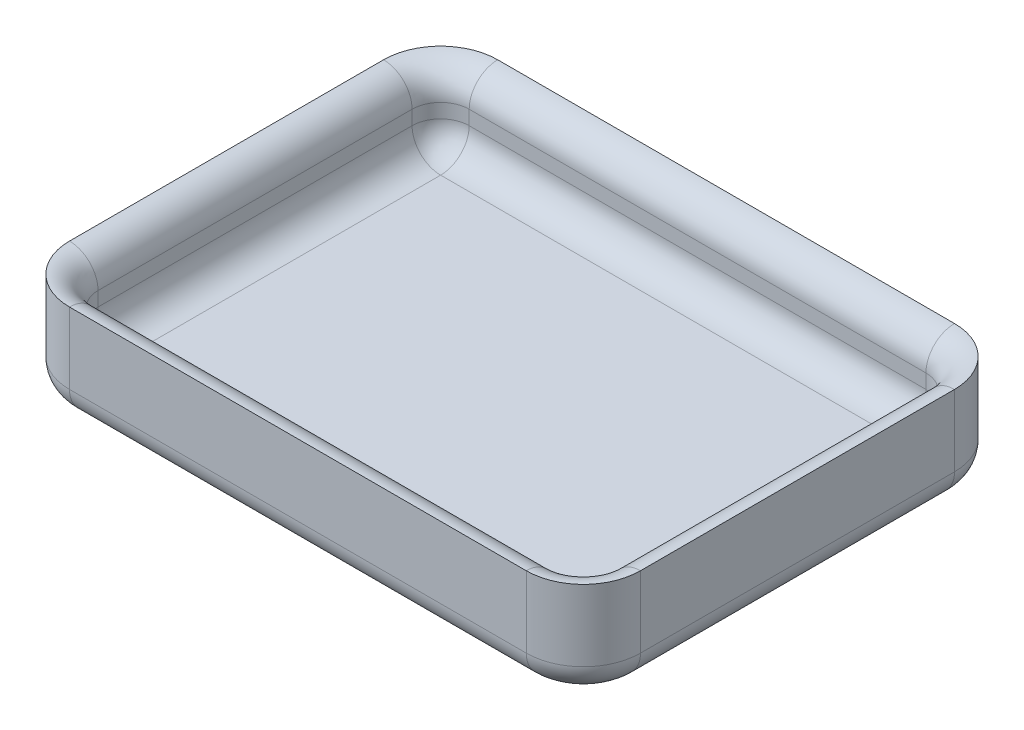
ISO-10303-21;
HEADER;
FILE_DESCRIPTION(('STEP AP214'),'2;1');
FILE_NAME('part.step','',(''),(''),'','','');
FILE_SCHEMA(('AUTOMOTIVE_DESIGN { 1 0 10303 214 1 1 1 1 }'));
ENDSEC;
DATA;
#1=APPLICATION_CONTEXT('core data for automotive mechanical design processes');
#2=APPLICATION_PROTOCOL_DEFINITION('international standard','automotive_design',2000,#1);
#3=PRODUCT_CONTEXT('',#1,'mechanical');
#4=PRODUCT('Part','Part','',(#3));
#5=PRODUCT_RELATED_PRODUCT_CATEGORY('part','',(#4));
#6=PRODUCT_DEFINITION_FORMATION('','',#4);
#7=PRODUCT_DEFINITION_CONTEXT('part definition',#1,'design');
#8=PRODUCT_DEFINITION('design','',#6,#7);
#9=PRODUCT_DEFINITION_SHAPE('','',#8);
#10=(LENGTH_UNIT() NAMED_UNIT(*) SI_UNIT(.MILLI.,.METRE.));
#11=(NAMED_UNIT(*) PLANE_ANGLE_UNIT() SI_UNIT($,.RADIAN.));
#12=(NAMED_UNIT(*) SI_UNIT($,.STERADIAN.) SOLID_ANGLE_UNIT());
#13=UNCERTAINTY_MEASURE_WITH_UNIT(LENGTH_MEASURE(1.E-05),#10,'distance_accuracy_value','');
#14=(GEOMETRIC_REPRESENTATION_CONTEXT(3) GLOBAL_UNCERTAINTY_ASSIGNED_CONTEXT((#13)) GLOBAL_UNIT_ASSIGNED_CONTEXT((#10,
#11,#12)) REPRESENTATION_CONTEXT('',''));
#15=CARTESIAN_POINT('',(0.,0.,0.));
#16=DIRECTION('',(0.,0.,1.));
#17=DIRECTION('',(1.,0.,0.));
#18=AXIS2_PLACEMENT_3D('',#15,#16,#17);
#19=CARTESIAN_POINT('',(-16.,7.,11.));
#20=DIRECTION('',(0.,-1.,0.));
#21=DIRECTION('',(0.,0.,-1.));
#22=AXIS2_PLACEMENT_3D('',#19,#20,#21);
#23=CYLINDRICAL_SURFACE('',#22,4.);
#24=DIRECTION('',(0.,-1.,0.));
#25=VECTOR('',#24,1.);
#26=CARTESIAN_POINT('',(-20.,7.,11.));
#27=LINE('',#26,#25);
#28=CARTESIAN_POINT('',(-20.,7.,11.));
#29=VERTEX_POINT('',#28);
#30=CARTESIAN_POINT('',(-20.,2.,11.));
#31=VERTEX_POINT('',#30);
#32=EDGE_CURVE('E336',#29,#31,#27,.T.);
#33=ORIENTED_EDGE('',*,*,#32,.T.);
#34=CARTESIAN_POINT('',(-16.,2.,11.));
#35=DIRECTION('',(0.,-1.,0.));
#36=DIRECTION('',(0.,0.,-1.));
#37=AXIS2_PLACEMENT_3D('',#34,#35,#36);
#38=CIRCLE('',#37,4.);
#39=CARTESIAN_POINT('',(-16.,2.,15.));
#40=VERTEX_POINT('',#39);
#41=EDGE_CURVE('E205',#31,#40,#38,.F.);
#42=ORIENTED_EDGE('',*,*,#41,.T.);
#43=DIRECTION('',(0.,-1.,0.));
#44=VECTOR('',#43,1.);
#45=CARTESIAN_POINT('',(-16.,7.,15.));
#46=LINE('',#45,#44);
#47=CARTESIAN_POINT('',(-16.,7.,15.));
#48=VERTEX_POINT('',#47);
#49=EDGE_CURVE('E188',#48,#40,#46,.T.);
#50=ORIENTED_EDGE('',*,*,#49,.F.);
#51=CARTESIAN_POINT('',(-16.,7.,11.));
#52=DIRECTION('',(0.,1.,0.));
#53=DIRECTION('',(0.,0.,-1.));
#54=AXIS2_PLACEMENT_3D('',#51,#52,#53);
#55=CIRCLE('',#54,4.);
#56=EDGE_CURVE('E196',#29,#48,#55,.T.);
#57=ORIENTED_EDGE('',*,*,#56,.F.);
#58=EDGE_LOOP('',(#33,#42,#50,#57));
#59=FACE_BOUND('',#58,.T.);
#60=ADVANCED_FACE('F33',(#59),#23,.T.);
#61=CARTESIAN_POINT('',(-16.,7.,15.));
#62=DIRECTION('',(0.,0.,-1.));
#63=DIRECTION('',(-1.,0.,0.));
#64=AXIS2_PLACEMENT_3D('',#61,#62,#63);
#65=PLANE('',#64);
#66=ORIENTED_EDGE('',*,*,#49,.T.);
#67=DIRECTION('',(1.,0.,0.));
#68=VECTOR('',#67,1.);
#69=CARTESIAN_POINT('',(16.,2.,15.));
#70=LINE('',#69,#68);
#71=CARTESIAN_POINT('',(16.,2.,15.));
#72=VERTEX_POINT('',#71);
#73=EDGE_CURVE('E251',#40,#72,#70,.T.);
#74=ORIENTED_EDGE('',*,*,#73,.T.);
#75=DIRECTION('',(0.,-1.,0.));
#76=VECTOR('',#75,1.);
#77=CARTESIAN_POINT('',(16.,7.,15.));
#78=LINE('',#77,#76);
#79=CARTESIAN_POINT('',(16.,7.,15.));
#80=VERTEX_POINT('',#79);
#81=EDGE_CURVE('E190',#80,#72,#78,.T.);
#82=ORIENTED_EDGE('',*,*,#81,.F.);
#83=DIRECTION('',(1.,0.,0.));
#84=VECTOR('',#83,1.);
#85=CARTESIAN_POINT('',(-16.,7.,15.));
#86=LINE('',#85,#84);
#87=EDGE_CURVE('E185',#48,#80,#86,.T.);
#88=ORIENTED_EDGE('',*,*,#87,.F.);
#89=EDGE_LOOP('',(#66,#74,#82,#88));
#90=FACE_BOUND('',#89,.T.);
#91=ADVANCED_FACE('F187',(#90),#65,.F.);
#92=CARTESIAN_POINT('',(16.,7.,11.));
#93=DIRECTION('',(0.,-1.,0.));
#94=DIRECTION('',(0.,0.,-1.));
#95=AXIS2_PLACEMENT_3D('',#92,#93,#94);
#96=CYLINDRICAL_SURFACE('',#95,4.);
#97=ORIENTED_EDGE('',*,*,#81,.T.);
#98=CARTESIAN_POINT('',(16.,2.,11.));
#99=DIRECTION('',(0.,-1.,0.));
#100=DIRECTION('',(0.,0.,-1.));
#101=AXIS2_PLACEMENT_3D('',#98,#99,#100);
#102=CIRCLE('',#101,4.);
#103=CARTESIAN_POINT('',(20.,2.,11.));
#104=VERTEX_POINT('',#103);
#105=EDGE_CURVE('E424',#72,#104,#102,.F.);
#106=ORIENTED_EDGE('',*,*,#105,.T.);
#107=DIRECTION('',(0.,-1.,0.));
#108=VECTOR('',#107,1.);
#109=CARTESIAN_POINT('',(20.,7.,11.));
#110=LINE('',#109,#108);
#111=CARTESIAN_POINT('',(20.,7.,11.));
#112=VERTEX_POINT('',#111);
#113=EDGE_CURVE('E350',#112,#104,#110,.T.);
#114=ORIENTED_EDGE('',*,*,#113,.F.);
#115=CARTESIAN_POINT('',(16.,7.,11.));
#116=DIRECTION('',(0.,1.,0.));
#117=DIRECTION('',(0.,0.,1.));
#118=AXIS2_PLACEMENT_3D('',#115,#116,#117);
#119=CIRCLE('',#118,4.);
#120=EDGE_CURVE('E195',#80,#112,#119,.T.);
#121=ORIENTED_EDGE('',*,*,#120,.F.);
#122=EDGE_LOOP('',(#97,#106,#114,#121));
#123=FACE_BOUND('',#122,.T.);
#124=ADVANCED_FACE('F428',(#123),#96,.T.);
#125=CARTESIAN_POINT('',(20.,7.,11.));
#126=DIRECTION('',(-1.,0.,0.));
#127=DIRECTION('',(0.,0.,1.));
#128=AXIS2_PLACEMENT_3D('',#125,#126,#127);
#129=PLANE('',#128);
#130=ORIENTED_EDGE('',*,*,#113,.T.);
#131=DIRECTION('',(0.,0.,-1.));
#132=VECTOR('',#131,1.);
#133=CARTESIAN_POINT('',(20.,2.,-11.));
#134=LINE('',#133,#132);
#135=CARTESIAN_POINT('',(20.,2.,-11.));
#136=VERTEX_POINT('',#135);
#137=EDGE_CURVE('E423',#104,#136,#134,.T.);
#138=ORIENTED_EDGE('',*,*,#137,.T.);
#139=DIRECTION('',(0.,-1.,0.));
#140=VECTOR('',#139,1.);
#141=CARTESIAN_POINT('',(20.,7.,-11.));
#142=LINE('',#141,#140);
#143=CARTESIAN_POINT('',(20.,7.,-11.));
#144=VERTEX_POINT('',#143);
#145=EDGE_CURVE('E347',#144,#136,#142,.T.);
#146=ORIENTED_EDGE('',*,*,#145,.F.);
#147=DIRECTION('',(0.,0.,-1.));
#148=VECTOR('',#147,1.);
#149=CARTESIAN_POINT('',(20.,7.,11.));
#150=LINE('',#149,#148);
#151=EDGE_CURVE('E323',#112,#144,#150,.T.);
#152=ORIENTED_EDGE('',*,*,#151,.F.);
#153=EDGE_LOOP('',(#130,#138,#146,#152));
#154=FACE_BOUND('',#153,.T.);
#155=ADVANCED_FACE('F465',(#154),#129,.F.);
#156=CARTESIAN_POINT('',(16.,7.,-11.));
#157=DIRECTION('',(0.,-1.,0.));
#158=DIRECTION('',(0.,0.,-1.));
#159=AXIS2_PLACEMENT_3D('',#156,#157,#158);
#160=CYLINDRICAL_SURFACE('',#159,4.);
#161=ORIENTED_EDGE('',*,*,#145,.T.);
#162=CARTESIAN_POINT('',(16.,2.,-11.));
#163=DIRECTION('',(0.,-1.,0.));
#164=DIRECTION('',(0.,0.,-1.));
#165=AXIS2_PLACEMENT_3D('',#162,#163,#164);
#166=CIRCLE('',#165,4.);
#167=CARTESIAN_POINT('',(16.,2.,-15.));
#168=VERTEX_POINT('',#167);
#169=EDGE_CURVE('E421',#136,#168,#166,.F.);
#170=ORIENTED_EDGE('',*,*,#169,.T.);
#171=DIRECTION('',(0.,-1.,0.));
#172=VECTOR('',#171,1.);
#173=CARTESIAN_POINT('',(16.,7.,-15.));
#174=LINE('',#173,#172);
#175=CARTESIAN_POINT('',(16.,7.,-15.));
#176=VERTEX_POINT('',#175);
#177=EDGE_CURVE('E344',#176,#168,#174,.T.);
#178=ORIENTED_EDGE('',*,*,#177,.F.);
#179=CARTESIAN_POINT('',(16.,7.,-11.));
#180=DIRECTION('',(0.,1.,0.));
#181=DIRECTION('',(0.,0.,-1.));
#182=AXIS2_PLACEMENT_3D('',#179,#180,#181);
#183=CIRCLE('',#182,4.);
#184=EDGE_CURVE('E326',#144,#176,#183,.T.);
#185=ORIENTED_EDGE('',*,*,#184,.F.);
#186=EDGE_LOOP('',(#161,#170,#178,#185));
#187=FACE_BOUND('',#186,.T.);
#188=ADVANCED_FACE('F469',(#187),#160,.T.);
#189=CARTESIAN_POINT('',(-16.,7.,-15.));
#190=DIRECTION('',(0.,0.,1.));
#191=DIRECTION('',(1.,0.,0.));
#192=AXIS2_PLACEMENT_3D('',#189,#190,#191);
#193=PLANE('',#192);
#194=ORIENTED_EDGE('',*,*,#177,.T.);
#195=DIRECTION('',(-1.,0.,0.));
#196=VECTOR('',#195,1.);
#197=CARTESIAN_POINT('',(-16.,2.,-15.));
#198=LINE('',#197,#196);
#199=CARTESIAN_POINT('',(-16.,2.,-15.));
#200=VERTEX_POINT('',#199);
#201=EDGE_CURVE('E419',#168,#200,#198,.T.);
#202=ORIENTED_EDGE('',*,*,#201,.T.);
#203=DIRECTION('',(0.,-1.,0.));
#204=VECTOR('',#203,1.);
#205=CARTESIAN_POINT('',(-16.,7.,-15.));
#206=LINE('',#205,#204);
#207=CARTESIAN_POINT('',(-16.,7.,-15.));
#208=VERTEX_POINT('',#207);
#209=EDGE_CURVE('E341',#208,#200,#206,.T.);
#210=ORIENTED_EDGE('',*,*,#209,.F.);
#211=DIRECTION('',(-1.,0.,0.));
#212=VECTOR('',#211,1.);
#213=CARTESIAN_POINT('',(-16.,7.,-15.));
#214=LINE('',#213,#212);
#215=EDGE_CURVE('E329',#176,#208,#214,.T.);
#216=ORIENTED_EDGE('',*,*,#215,.F.);
#217=EDGE_LOOP('',(#194,#202,#210,#216));
#218=FACE_BOUND('',#217,.T.);
#219=ADVANCED_FACE('F784',(#218),#193,.F.);
#220=CARTESIAN_POINT('',(-16.,7.,-11.));
#221=DIRECTION('',(0.,-1.,0.));
#222=DIRECTION('',(0.,0.,-1.));
#223=AXIS2_PLACEMENT_3D('',#220,#221,#222);
#224=CYLINDRICAL_SURFACE('',#223,4.);
#225=ORIENTED_EDGE('',*,*,#209,.T.);
#226=CARTESIAN_POINT('',(-16.,2.,-11.));
#227=DIRECTION('',(0.,-1.,0.));
#228=DIRECTION('',(0.,0.,-1.));
#229=AXIS2_PLACEMENT_3D('',#226,#227,#228);
#230=CIRCLE('',#229,4.);
#231=CARTESIAN_POINT('',(-20.,2.,-11.));
#232=VERTEX_POINT('',#231);
#233=EDGE_CURVE('E417',#200,#232,#230,.F.);
#234=ORIENTED_EDGE('',*,*,#233,.T.);
#235=DIRECTION('',(0.,-1.,0.));
#236=VECTOR('',#235,1.);
#237=CARTESIAN_POINT('',(-20.,7.,-11.));
#238=LINE('',#237,#236);
#239=CARTESIAN_POINT('',(-20.,7.,-11.));
#240=VERTEX_POINT('',#239);
#241=EDGE_CURVE('E338',#240,#232,#238,.T.);
#242=ORIENTED_EDGE('',*,*,#241,.F.);
#243=CARTESIAN_POINT('',(-16.,7.,-11.));
#244=DIRECTION('',(0.,1.,0.));
#245=DIRECTION('',(0.,0.,-1.));
#246=AXIS2_PLACEMENT_3D('',#243,#244,#245);
#247=CIRCLE('',#246,4.);
#248=EDGE_CURVE('E331',#208,#240,#247,.T.);
#249=ORIENTED_EDGE('',*,*,#248,.F.);
#250=EDGE_LOOP('',(#225,#234,#242,#249));
#251=FACE_BOUND('',#250,.T.);
#252=ADVANCED_FACE('F775',(#251),#224,.T.);
#253=CARTESIAN_POINT('',(-20.,7.,11.));
#254=DIRECTION('',(1.,0.,0.));
#255=DIRECTION('',(0.,0.,-1.));
#256=AXIS2_PLACEMENT_3D('',#253,#254,#255);
#257=PLANE('',#256);
#258=ORIENTED_EDGE('',*,*,#241,.T.);
#259=DIRECTION('',(0.,0.,1.));
#260=VECTOR('',#259,1.);
#261=CARTESIAN_POINT('',(-20.,2.,11.));
#262=LINE('',#261,#260);
#263=EDGE_CURVE('E415',#232,#31,#262,.T.);
#264=ORIENTED_EDGE('',*,*,#263,.T.);
#265=ORIENTED_EDGE('',*,*,#32,.F.);
#266=DIRECTION('',(0.,0.,1.));
#267=VECTOR('',#266,1.);
#268=CARTESIAN_POINT('',(-20.,7.,11.));
#269=LINE('',#268,#267);
#270=EDGE_CURVE('E334',#240,#29,#269,.T.);
#271=ORIENTED_EDGE('',*,*,#270,.F.);
#272=EDGE_LOOP('',(#258,#264,#265,#271));
#273=FACE_BOUND('',#272,.T.);
#274=ADVANCED_FACE('F768',(#273),#257,.F.);
#275=CARTESIAN_POINT('',(-16.,0.,11.));
#276=DIRECTION('',(0.,-1.,0.));
#277=DIRECTION('',(0.,0.,-1.));
#278=AXIS2_PLACEMENT_3D('',#275,#276,#277);
#279=PLANE('',#278);
#280=DIRECTION('',(1.,0.,0.));
#281=VECTOR('',#280,1.);
#282=CARTESIAN_POINT('',(-16.,0.,13.));
#283=LINE('',#282,#281);
#284=CARTESIAN_POINT('',(16.,0.,13.));
#285=VERTEX_POINT('',#284);
#286=CARTESIAN_POINT('',(-16.,0.,13.));
#287=VERTEX_POINT('',#286);
#288=EDGE_CURVE('E398',#285,#287,#283,.F.);
#289=ORIENTED_EDGE('',*,*,#288,.T.);
#290=CARTESIAN_POINT('',(-16.,0.,11.));
#291=DIRECTION('',(0.,-1.,0.));
#292=DIRECTION('',(0.,0.,-1.));
#293=AXIS2_PLACEMENT_3D('',#290,#291,#292);
#294=CIRCLE('',#293,2.);
#295=CARTESIAN_POINT('',(-18.,0.,11.));
#296=VERTEX_POINT('',#295);
#297=EDGE_CURVE('E412',#287,#296,#294,.T.);
#298=ORIENTED_EDGE('',*,*,#297,.T.);
#299=DIRECTION('',(0.,0.,1.));
#300=VECTOR('',#299,1.);
#301=CARTESIAN_POINT('',(-18.,0.,-11.));
#302=LINE('',#301,#300);
#303=CARTESIAN_POINT('',(-18.,0.,-11.));
#304=VERTEX_POINT('',#303);
#305=EDGE_CURVE('E410',#296,#304,#302,.F.);
#306=ORIENTED_EDGE('',*,*,#305,.T.);
#307=CARTESIAN_POINT('',(-16.,0.,-11.));
#308=DIRECTION('',(0.,-1.,0.));
#309=DIRECTION('',(0.,0.,-1.));
#310=AXIS2_PLACEMENT_3D('',#307,#308,#309);
#311=CIRCLE('',#310,2.);
#312=CARTESIAN_POINT('',(-16.,0.,-13.));
#313=VERTEX_POINT('',#312);
#314=EDGE_CURVE('E408',#304,#313,#311,.T.);
#315=ORIENTED_EDGE('',*,*,#314,.T.);
#316=DIRECTION('',(-1.,0.,0.));
#317=VECTOR('',#316,1.);
#318=CARTESIAN_POINT('',(16.,0.,-13.));
#319=LINE('',#318,#317);
#320=CARTESIAN_POINT('',(16.,0.,-13.));
#321=VERTEX_POINT('',#320);
#322=EDGE_CURVE('E406',#313,#321,#319,.F.);
#323=ORIENTED_EDGE('',*,*,#322,.T.);
#324=CARTESIAN_POINT('',(16.,0.,-11.));
#325=DIRECTION('',(0.,-1.,0.));
#326=DIRECTION('',(0.,0.,-1.));
#327=AXIS2_PLACEMENT_3D('',#324,#325,#326);
#328=CIRCLE('',#327,2.);
#329=CARTESIAN_POINT('',(18.,0.,-11.));
#330=VERTEX_POINT('',#329);
#331=EDGE_CURVE('E404',#321,#330,#328,.T.);
#332=ORIENTED_EDGE('',*,*,#331,.T.);
#333=DIRECTION('',(0.,0.,-1.));
#334=VECTOR('',#333,1.);
#335=CARTESIAN_POINT('',(18.,0.,11.));
#336=LINE('',#335,#334);
#337=CARTESIAN_POINT('',(18.,0.,11.));
#338=VERTEX_POINT('',#337);
#339=EDGE_CURVE('E402',#330,#338,#336,.F.);
#340=ORIENTED_EDGE('',*,*,#339,.T.);
#341=CARTESIAN_POINT('',(16.,0.,11.));
#342=DIRECTION('',(0.,-1.,0.));
#343=DIRECTION('',(0.,0.,-1.));
#344=AXIS2_PLACEMENT_3D('',#341,#342,#343);
#345=CIRCLE('',#344,2.);
#346=EDGE_CURVE('E400',#338,#285,#345,.T.);
#347=ORIENTED_EDGE('',*,*,#346,.T.);
#348=EDGE_LOOP('',(#289,#298,#306,#315,#323,#332,#340,#347));
#349=FACE_BOUND('',#348,.T.);
#350=ADVANCED_FACE('F437',(#349),#279,.T.);
#351=CARTESIAN_POINT('',(16.,2.,-11.));
#352=DIRECTION('',(0.,1.,0.));
#353=DIRECTION('',(0.,0.,1.));
#354=AXIS2_PLACEMENT_3D('',#351,#352,#353);
#355=CYLINDRICAL_SURFACE('',#354,2.);
#356=DIRECTION('',(0.,1.,0.));
#357=VECTOR('',#356,1.);
#358=CARTESIAN_POINT('',(18.,2.,-11.));
#359=LINE('',#358,#357);
#360=CARTESIAN_POINT('',(18.,4.,-11.));
#361=VERTEX_POINT('',#360);
#362=CARTESIAN_POINT('',(18.,5.,-11.));
#363=VERTEX_POINT('',#362);
#364=EDGE_CURVE('E217',#361,#363,#359,.T.);
#365=ORIENTED_EDGE('',*,*,#364,.T.);
#366=CARTESIAN_POINT('',(16.,5.,-11.));
#367=DIRECTION('',(0.,-1.,0.));
#368=DIRECTION('',(0.,0.,-1.));
#369=AXIS2_PLACEMENT_3D('',#366,#367,#368);
#370=CIRCLE('',#369,2.);
#371=CARTESIAN_POINT('',(16.,5.,-13.));
#372=VERTEX_POINT('',#371);
#373=EDGE_CURVE('E42',#363,#372,#370,.F.);
#374=ORIENTED_EDGE('',*,*,#373,.T.);
#375=DIRECTION('',(0.,1.,0.));
#376=VECTOR('',#375,1.);
#377=CARTESIAN_POINT('',(16.,2.,-13.));
#378=LINE('',#377,#376);
#379=CARTESIAN_POINT('',(16.,4.,-13.));
#380=VERTEX_POINT('',#379);
#381=EDGE_CURVE('E319',#380,#372,#378,.T.);
#382=ORIENTED_EDGE('',*,*,#381,.F.);
#383=CARTESIAN_POINT('',(16.,4.,-11.));
#384=DIRECTION('',(0.,1.,0.));
#385=DIRECTION('',(0.,0.,1.));
#386=AXIS2_PLACEMENT_3D('',#383,#384,#385);
#387=CIRCLE('',#386,2.);
#388=EDGE_CURVE('E373',#380,#361,#387,.F.);
#389=ORIENTED_EDGE('',*,*,#388,.T.);
#390=EDGE_LOOP('',(#365,#374,#382,#389));
#391=FACE_BOUND('',#390,.T.);
#392=ADVANCED_FACE('F753',(#391),#355,.F.);
#393=CARTESIAN_POINT('',(18.,2.,11.));
#394=DIRECTION('',(1.,0.,0.));
#395=DIRECTION('',(0.,0.,-1.));
#396=AXIS2_PLACEMENT_3D('',#393,#394,#395);
#397=PLANE('',#396);
#398=DIRECTION('',(0.,1.,0.));
#399=VECTOR('',#398,1.);
#400=CARTESIAN_POINT('',(18.,2.,11.));
#401=LINE('',#400,#399);
#402=CARTESIAN_POINT('',(18.,4.,11.));
#403=VERTEX_POINT('',#402);
#404=CARTESIAN_POINT('',(18.,5.,11.));
#405=VERTEX_POINT('',#404);
#406=EDGE_CURVE('E296',#403,#405,#401,.T.);
#407=ORIENTED_EDGE('',*,*,#406,.T.);
#408=DIRECTION('',(0.,0.,-1.));
#409=VECTOR('',#408,1.);
#410=CARTESIAN_POINT('',(18.,5.,11.));
#411=LINE('',#410,#409);
#412=EDGE_CURVE('E11',#405,#363,#411,.T.);
#413=ORIENTED_EDGE('',*,*,#412,.T.);
#414=ORIENTED_EDGE('',*,*,#364,.F.);
#415=DIRECTION('',(0.,0.,-1.));
#416=VECTOR('',#415,1.);
#417=CARTESIAN_POINT('',(18.,4.,11.));
#418=LINE('',#417,#416);
#419=EDGE_CURVE('E302',#361,#403,#418,.F.);
#420=ORIENTED_EDGE('',*,*,#419,.T.);
#421=EDGE_LOOP('',(#407,#413,#414,#420));
#422=FACE_BOUND('',#421,.T.);
#423=ADVANCED_FACE('F300',(#422),#397,.F.);
#424=CARTESIAN_POINT('',(16.,2.,11.));
#425=DIRECTION('',(0.,1.,0.));
#426=DIRECTION('',(0.,0.,1.));
#427=AXIS2_PLACEMENT_3D('',#424,#425,#426);
#428=CYLINDRICAL_SURFACE('',#427,2.);
#429=DIRECTION('',(0.,1.,0.));
#430=VECTOR('',#429,1.);
#431=CARTESIAN_POINT('',(16.,2.,13.));
#432=LINE('',#431,#430);
#433=CARTESIAN_POINT('',(16.,4.,13.));
#434=VERTEX_POINT('',#433);
#435=CARTESIAN_POINT('',(16.,5.,13.));
#436=VERTEX_POINT('',#435);
#437=EDGE_CURVE('E299',#434,#436,#432,.T.);
#438=ORIENTED_EDGE('',*,*,#437,.T.);
#439=CARTESIAN_POINT('',(16.,5.,11.));
#440=DIRECTION('',(0.,-1.,0.));
#441=DIRECTION('',(0.,0.,-1.));
#442=AXIS2_PLACEMENT_3D('',#439,#440,#441);
#443=CIRCLE('',#442,2.);
#444=EDGE_CURVE('E272',#436,#405,#443,.F.);
#445=ORIENTED_EDGE('',*,*,#444,.T.);
#446=ORIENTED_EDGE('',*,*,#406,.F.);
#447=CARTESIAN_POINT('',(16.,4.,11.));
#448=DIRECTION('',(0.,1.,0.));
#449=DIRECTION('',(0.,0.,1.));
#450=AXIS2_PLACEMENT_3D('',#447,#448,#449);
#451=CIRCLE('',#450,2.);
#452=EDGE_CURVE('E206',#403,#434,#451,.F.);
#453=ORIENTED_EDGE('',*,*,#452,.T.);
#454=EDGE_LOOP('',(#438,#445,#446,#453));
#455=FACE_BOUND('',#454,.T.);
#456=ADVANCED_FACE('F294',(#455),#428,.F.);
#457=CARTESIAN_POINT('',(-16.,2.,13.));
#458=DIRECTION('',(0.,0.,1.));
#459=DIRECTION('',(1.,0.,0.));
#460=AXIS2_PLACEMENT_3D('',#457,#458,#459);
#461=PLANE('',#460);
#462=DIRECTION('',(0.,1.,0.));
#463=VECTOR('',#462,1.);
#464=CARTESIAN_POINT('',(-16.,2.,13.));
#465=LINE('',#464,#463);
#466=CARTESIAN_POINT('',(-16.,4.,13.));
#467=VERTEX_POINT('',#466);
#468=CARTESIAN_POINT('',(-16.,5.,13.));
#469=VERTEX_POINT('',#468);
#470=EDGE_CURVE('E305',#467,#469,#465,.T.);
#471=ORIENTED_EDGE('',*,*,#470,.T.);
#472=DIRECTION('',(1.,0.,0.));
#473=VECTOR('',#472,1.);
#474=CARTESIAN_POINT('',(-16.,5.,13.));
#475=LINE('',#474,#473);
#476=EDGE_CURVE('E220',#469,#436,#475,.T.);
#477=ORIENTED_EDGE('',*,*,#476,.T.);
#478=ORIENTED_EDGE('',*,*,#437,.F.);
#479=DIRECTION('',(1.,0.,0.));
#480=VECTOR('',#479,1.);
#481=CARTESIAN_POINT('',(-16.,4.,13.));
#482=LINE('',#481,#480);
#483=EDGE_CURVE('E364',#434,#467,#482,.F.);
#484=ORIENTED_EDGE('',*,*,#483,.T.);
#485=EDGE_LOOP('',(#471,#477,#478,#484));
#486=FACE_BOUND('',#485,.T.);
#487=ADVANCED_FACE('F729',(#486),#461,.F.);
#488=CARTESIAN_POINT('',(-16.,2.,11.));
#489=DIRECTION('',(0.,1.,0.));
#490=DIRECTION('',(0.,0.,1.));
#491=AXIS2_PLACEMENT_3D('',#488,#489,#490);
#492=CYLINDRICAL_SURFACE('',#491,2.);
#493=DIRECTION('',(0.,1.,0.));
#494=VECTOR('',#493,1.);
#495=CARTESIAN_POINT('',(-18.,2.,11.));
#496=LINE('',#495,#494);
#497=CARTESIAN_POINT('',(-18.,4.,11.));
#498=VERTEX_POINT('',#497);
#499=CARTESIAN_POINT('',(-18.,5.,11.));
#500=VERTEX_POINT('',#499);
#501=EDGE_CURVE('E310',#498,#500,#496,.T.);
#502=ORIENTED_EDGE('',*,*,#501,.T.);
#503=CARTESIAN_POINT('',(-16.,5.,11.));
#504=DIRECTION('',(0.,-1.,0.));
#505=DIRECTION('',(0.,0.,-1.));
#506=AXIS2_PLACEMENT_3D('',#503,#504,#505);
#507=CIRCLE('',#506,2.);
#508=EDGE_CURVE('E276',#500,#469,#507,.F.);
#509=ORIENTED_EDGE('',*,*,#508,.T.);
#510=ORIENTED_EDGE('',*,*,#470,.F.);
#511=CARTESIAN_POINT('',(-16.,4.,11.));
#512=DIRECTION('',(0.,1.,0.));
#513=DIRECTION('',(0.,0.,1.));
#514=AXIS2_PLACEMENT_3D('',#511,#512,#513);
#515=CIRCLE('',#514,2.);
#516=EDGE_CURVE('E366',#467,#498,#515,.F.);
#517=ORIENTED_EDGE('',*,*,#516,.T.);
#518=EDGE_LOOP('',(#502,#509,#510,#517));
#519=FACE_BOUND('',#518,.T.);
#520=ADVANCED_FACE('F720',(#519),#492,.F.);
#521=CARTESIAN_POINT('',(-18.,2.,-11.));
#522=DIRECTION('',(-1.,0.,0.));
#523=DIRECTION('',(0.,0.,1.));
#524=AXIS2_PLACEMENT_3D('',#521,#522,#523);
#525=PLANE('',#524);
#526=DIRECTION('',(0.,1.,0.));
#527=VECTOR('',#526,1.);
#528=CARTESIAN_POINT('',(-18.,2.,-11.));
#529=LINE('',#528,#527);
#530=CARTESIAN_POINT('',(-18.,4.,-11.));
#531=VERTEX_POINT('',#530);
#532=CARTESIAN_POINT('',(-18.,5.,-11.));
#533=VERTEX_POINT('',#532);
#534=EDGE_CURVE('E313',#531,#533,#529,.T.);
#535=ORIENTED_EDGE('',*,*,#534,.T.);
#536=DIRECTION('',(0.,0.,1.));
#537=VECTOR('',#536,1.);
#538=CARTESIAN_POINT('',(-18.,5.,-11.));
#539=LINE('',#538,#537);
#540=EDGE_CURVE('E278',#533,#500,#539,.T.);
#541=ORIENTED_EDGE('',*,*,#540,.T.);
#542=ORIENTED_EDGE('',*,*,#501,.F.);
#543=DIRECTION('',(0.,0.,1.));
#544=VECTOR('',#543,1.);
#545=CARTESIAN_POINT('',(-18.,4.,-11.));
#546=LINE('',#545,#544);
#547=EDGE_CURVE('E368',#498,#531,#546,.F.);
#548=ORIENTED_EDGE('',*,*,#547,.T.);
#549=EDGE_LOOP('',(#535,#541,#542,#548));
#550=FACE_BOUND('',#549,.T.);
#551=ADVANCED_FACE('F711',(#550),#525,.F.);
#552=CARTESIAN_POINT('',(-16.,2.,-11.));
#553=DIRECTION('',(0.,1.,0.));
#554=DIRECTION('',(0.,0.,1.));
#555=AXIS2_PLACEMENT_3D('',#552,#553,#554);
#556=CYLINDRICAL_SURFACE('',#555,2.);
#557=DIRECTION('',(0.,1.,0.));
#558=VECTOR('',#557,1.);
#559=CARTESIAN_POINT('',(-16.,2.,-13.));
#560=LINE('',#559,#558);
#561=CARTESIAN_POINT('',(-16.,4.,-13.));
#562=VERTEX_POINT('',#561);
#563=CARTESIAN_POINT('',(-16.,5.,-13.));
#564=VERTEX_POINT('',#563);
#565=EDGE_CURVE('E316',#562,#564,#560,.T.);
#566=ORIENTED_EDGE('',*,*,#565,.T.);
#567=CARTESIAN_POINT('',(-16.,5.,-11.));
#568=DIRECTION('',(0.,-1.,0.));
#569=DIRECTION('',(0.,0.,-1.));
#570=AXIS2_PLACEMENT_3D('',#567,#568,#569);
#571=CIRCLE('',#570,2.);
#572=EDGE_CURVE('E280',#564,#533,#571,.F.);
#573=ORIENTED_EDGE('',*,*,#572,.T.);
#574=ORIENTED_EDGE('',*,*,#534,.F.);
#575=CARTESIAN_POINT('',(-16.,4.,-11.));
#576=DIRECTION('',(0.,1.,0.));
#577=DIRECTION('',(0.,0.,1.));
#578=AXIS2_PLACEMENT_3D('',#575,#576,#577);
#579=CIRCLE('',#578,2.);
#580=EDGE_CURVE('E370',#531,#562,#579,.F.);
#581=ORIENTED_EDGE('',*,*,#580,.T.);
#582=EDGE_LOOP('',(#566,#573,#574,#581));
#583=FACE_BOUND('',#582,.T.);
#584=ADVANCED_FACE('F702',(#583),#556,.F.);
#585=CARTESIAN_POINT('',(16.,2.,-13.));
#586=DIRECTION('',(0.,0.,-1.));
#587=DIRECTION('',(-1.,0.,0.));
#588=AXIS2_PLACEMENT_3D('',#585,#586,#587);
#589=PLANE('',#588);
#590=ORIENTED_EDGE('',*,*,#381,.T.);
#591=DIRECTION('',(-1.,0.,0.));
#592=VECTOR('',#591,1.);
#593=CARTESIAN_POINT('',(16.,5.,-13.));
#594=LINE('',#593,#592);
#595=EDGE_CURVE('E282',#372,#564,#594,.T.);
#596=ORIENTED_EDGE('',*,*,#595,.T.);
#597=ORIENTED_EDGE('',*,*,#565,.F.);
#598=DIRECTION('',(-1.,0.,0.));
#599=VECTOR('',#598,1.);
#600=CARTESIAN_POINT('',(16.,4.,-13.));
#601=LINE('',#600,#599);
#602=EDGE_CURVE('E375',#562,#380,#601,.F.);
#603=ORIENTED_EDGE('',*,*,#602,.T.);
#604=EDGE_LOOP('',(#590,#596,#597,#603));
#605=FACE_BOUND('',#604,.T.);
#606=ADVANCED_FACE('F694',(#605),#589,.F.);
#607=CARTESIAN_POINT('',(16.,2.,-11.));
#608=DIRECTION('',(0.,1.,0.));
#609=DIRECTION('',(0.,0.,1.));
#610=AXIS2_PLACEMENT_3D('',#607,#608,#609);
#611=PLANE('',#610);
#612=DIRECTION('',(0.,0.,1.));
#613=VECTOR('',#612,1.);
#614=CARTESIAN_POINT('',(-16.,2.,-11.));
#615=LINE('',#614,#613);
#616=CARTESIAN_POINT('',(-16.,2.,-11.));
#617=VERTEX_POINT('',#616);
#618=CARTESIAN_POINT('',(-16.,2.,11.));
#619=VERTEX_POINT('',#618);
#620=EDGE_CURVE('E359',#617,#619,#615,.T.);
#621=ORIENTED_EDGE('',*,*,#620,.T.);
#622=DIRECTION('',(1.,0.,0.));
#623=VECTOR('',#622,1.);
#624=CARTESIAN_POINT('',(16.,2.,11.));
#625=LINE('',#624,#623);
#626=CARTESIAN_POINT('',(16.,2.,11.));
#627=VERTEX_POINT('',#626);
#628=EDGE_CURVE('E361',#619,#627,#625,.T.);
#629=ORIENTED_EDGE('',*,*,#628,.T.);
#630=DIRECTION('',(0.,0.,-1.));
#631=VECTOR('',#630,1.);
#632=CARTESIAN_POINT('',(16.,2.,-11.));
#633=LINE('',#632,#631);
#634=CARTESIAN_POINT('',(16.,2.,-11.));
#635=VERTEX_POINT('',#634);
#636=EDGE_CURVE('E357',#627,#635,#633,.T.);
#637=ORIENTED_EDGE('',*,*,#636,.T.);
#638=DIRECTION('',(-1.,0.,0.));
#639=VECTOR('',#638,1.);
#640=CARTESIAN_POINT('',(16.,2.,-11.));
#641=LINE('',#640,#639);
#642=EDGE_CURVE('E355',#635,#617,#641,.T.);
#643=ORIENTED_EDGE('',*,*,#642,.T.);
#644=EDGE_LOOP('',(#621,#629,#637,#643));
#645=FACE_BOUND('',#644,.T.);
#646=ADVANCED_FACE('F523',(#645),#611,.T.);
#647=CARTESIAN_POINT('',(-16.,4.,-11.));
#648=DIRECTION('',(0.,1.,0.));
#649=DIRECTION('',(0.,0.,1.));
#650=AXIS2_PLACEMENT_3D('',#647,#648,#649);
#651=SPHERICAL_SURFACE('',#650,2.);
#652=CARTESIAN_POINT('',(-16.,4.,-11.));
#653=DIRECTION('',(-1.,0.,0.));
#654=DIRECTION('',(0.,0.,1.));
#655=AXIS2_PLACEMENT_3D('',#652,#653,#654);
#656=CIRCLE('',#655,2.);
#657=EDGE_CURVE('E392',#562,#617,#656,.T.);
#658=ORIENTED_EDGE('',*,*,#657,.F.);
#659=ORIENTED_EDGE('',*,*,#580,.F.);
#660=CARTESIAN_POINT('',(-16.,4.,-11.));
#661=DIRECTION('',(0.,0.,-1.));
#662=DIRECTION('',(-1.,0.,0.));
#663=AXIS2_PLACEMENT_3D('',#660,#661,#662);
#664=CIRCLE('',#663,2.);
#665=EDGE_CURVE('E320',#617,#531,#664,.T.);
#666=ORIENTED_EDGE('',*,*,#665,.F.);
#667=EDGE_LOOP('',(#658,#659,#666));
#668=FACE_BOUND('',#667,.T.);
#669=ADVANCED_FACE('F519',(#668),#651,.F.);
#670=CARTESIAN_POINT('',(-16.,4.,-11.));
#671=DIRECTION('',(0.,0.,1.));
#672=DIRECTION('',(1.,0.,0.));
#673=AXIS2_PLACEMENT_3D('',#670,#671,#672);
#674=CYLINDRICAL_SURFACE('',#673,2.);
#675=ORIENTED_EDGE('',*,*,#665,.T.);
#676=ORIENTED_EDGE('',*,*,#547,.F.);
#677=CARTESIAN_POINT('',(-16.,4.,11.));
#678=DIRECTION('',(0.,0.,-1.));
#679=DIRECTION('',(-1.,0.,0.));
#680=AXIS2_PLACEMENT_3D('',#677,#678,#679);
#681=CIRCLE('',#680,2.);
#682=EDGE_CURVE('E389',#619,#498,#681,.T.);
#683=ORIENTED_EDGE('',*,*,#682,.F.);
#684=ORIENTED_EDGE('',*,*,#620,.F.);
#685=EDGE_LOOP('',(#675,#676,#683,#684));
#686=FACE_BOUND('',#685,.T.);
#687=ADVANCED_FACE('F515',(#686),#674,.F.);
#688=CARTESIAN_POINT('',(16.,4.,-11.));
#689=DIRECTION('',(-1.,0.,0.));
#690=DIRECTION('',(0.,0.,1.));
#691=AXIS2_PLACEMENT_3D('',#688,#689,#690);
#692=CYLINDRICAL_SURFACE('',#691,2.);
#693=ORIENTED_EDGE('',*,*,#657,.T.);
#694=ORIENTED_EDGE('',*,*,#642,.F.);
#695=CARTESIAN_POINT('',(16.,4.,-11.));
#696=DIRECTION('',(-1.,0.,0.));
#697=DIRECTION('',(0.,-1.,0.));
#698=AXIS2_PLACEMENT_3D('',#695,#696,#697);
#699=CIRCLE('',#698,2.);
#700=EDGE_CURVE('E386',#380,#635,#699,.T.);
#701=ORIENTED_EDGE('',*,*,#700,.F.);
#702=ORIENTED_EDGE('',*,*,#602,.F.);
#703=EDGE_LOOP('',(#693,#694,#701,#702));
#704=FACE_BOUND('',#703,.T.);
#705=ADVANCED_FACE('F511',(#704),#692,.F.);
#706=CARTESIAN_POINT('',(-16.,4.,11.));
#707=DIRECTION('',(0.,1.,0.));
#708=DIRECTION('',(0.,0.,1.));
#709=AXIS2_PLACEMENT_3D('',#706,#707,#708);
#710=SPHERICAL_SURFACE('',#709,2.);
#711=ORIENTED_EDGE('',*,*,#682,.T.);
#712=ORIENTED_EDGE('',*,*,#516,.F.);
#713=CARTESIAN_POINT('',(-16.,4.,11.));
#714=DIRECTION('',(-1.,0.,0.));
#715=DIRECTION('',(0.,0.,1.));
#716=AXIS2_PLACEMENT_3D('',#713,#714,#715);
#717=CIRCLE('',#716,2.);
#718=EDGE_CURVE('E383',#619,#467,#717,.T.);
#719=ORIENTED_EDGE('',*,*,#718,.F.);
#720=EDGE_LOOP('',(#711,#712,#719));
#721=FACE_BOUND('',#720,.T.);
#722=ADVANCED_FACE('F507',(#721),#710,.F.);
#723=CARTESIAN_POINT('',(16.,4.,-11.));
#724=DIRECTION('',(0.,1.,0.));
#725=DIRECTION('',(0.,0.,1.));
#726=AXIS2_PLACEMENT_3D('',#723,#724,#725);
#727=SPHERICAL_SURFACE('',#726,2.);
#728=ORIENTED_EDGE('',*,*,#388,.F.);
#729=ORIENTED_EDGE('',*,*,#700,.T.);
#730=CARTESIAN_POINT('',(16.,4.,-11.));
#731=DIRECTION('',(0.,0.,-1.));
#732=DIRECTION('',(-1.,0.,0.));
#733=AXIS2_PLACEMENT_3D('',#730,#731,#732);
#734=CIRCLE('',#733,2.);
#735=EDGE_CURVE('E380',#361,#635,#734,.T.);
#736=ORIENTED_EDGE('',*,*,#735,.F.);
#737=EDGE_LOOP('',(#728,#729,#736));
#738=FACE_BOUND('',#737,.T.);
#739=ADVANCED_FACE('F503',(#738),#727,.F.);
#740=CARTESIAN_POINT('',(16.,4.,11.));
#741=DIRECTION('',(1.,0.,0.));
#742=DIRECTION('',(0.,0.,-1.));
#743=AXIS2_PLACEMENT_3D('',#740,#741,#742);
#744=CYLINDRICAL_SURFACE('',#743,2.);
#745=ORIENTED_EDGE('',*,*,#718,.T.);
#746=ORIENTED_EDGE('',*,*,#483,.F.);
#747=CARTESIAN_POINT('',(16.,4.,11.));
#748=DIRECTION('',(-1.,0.,0.));
#749=DIRECTION('',(0.,0.,1.));
#750=AXIS2_PLACEMENT_3D('',#747,#748,#749);
#751=CIRCLE('',#750,2.);
#752=EDGE_CURVE('E378',#627,#434,#751,.T.);
#753=ORIENTED_EDGE('',*,*,#752,.F.);
#754=ORIENTED_EDGE('',*,*,#628,.F.);
#755=EDGE_LOOP('',(#745,#746,#753,#754));
#756=FACE_BOUND('',#755,.T.);
#757=ADVANCED_FACE('F499',(#756),#744,.F.);
#758=CARTESIAN_POINT('',(16.,4.,-11.));
#759=DIRECTION('',(0.,0.,-1.));
#760=DIRECTION('',(-1.,0.,0.));
#761=AXIS2_PLACEMENT_3D('',#758,#759,#760);
#762=CYLINDRICAL_SURFACE('',#761,2.);
#763=ORIENTED_EDGE('',*,*,#735,.T.);
#764=ORIENTED_EDGE('',*,*,#636,.F.);
#765=CARTESIAN_POINT('',(16.,4.,11.));
#766=DIRECTION('',(0.,0.,-1.));
#767=DIRECTION('',(-1.,0.,0.));
#768=AXIS2_PLACEMENT_3D('',#765,#766,#767);
#769=CIRCLE('',#768,2.);
#770=EDGE_CURVE('E271',#403,#627,#769,.T.);
#771=ORIENTED_EDGE('',*,*,#770,.F.);
#772=ORIENTED_EDGE('',*,*,#419,.F.);
#773=EDGE_LOOP('',(#763,#764,#771,#772));
#774=FACE_BOUND('',#773,.T.);
#775=ADVANCED_FACE('F495',(#774),#762,.F.);
#776=CARTESIAN_POINT('',(16.,4.,11.));
#777=DIRECTION('',(0.,1.,0.));
#778=DIRECTION('',(0.,0.,1.));
#779=AXIS2_PLACEMENT_3D('',#776,#777,#778);
#780=SPHERICAL_SURFACE('',#779,2.);
#781=ORIENTED_EDGE('',*,*,#752,.T.);
#782=ORIENTED_EDGE('',*,*,#452,.F.);
#783=ORIENTED_EDGE('',*,*,#770,.T.);
#784=EDGE_LOOP('',(#781,#782,#783));
#785=FACE_BOUND('',#784,.T.);
#786=ADVANCED_FACE('F492',(#785),#780,.F.);
#787=CARTESIAN_POINT('',(16.,2.,-11.));
#788=DIRECTION('',(0.,-1.,0.));
#789=DIRECTION('',(0.,0.,-1.));
#790=AXIS2_PLACEMENT_3D('',#787,#788,#789);
#791=DEGENERATE_TOROIDAL_SURFACE('',#790,2.,2.,.T.);
#792=CARTESIAN_POINT('',(18.,2.,-11.));
#793=DIRECTION('',(0.,0.,1.));
#794=DIRECTION('',(1.,0.,0.));
#795=AXIS2_PLACEMENT_3D('',#792,#793,#794);
#796=CIRCLE('',#795,2.);
#797=EDGE_CURVE('E265',#330,#136,#796,.T.);
#798=ORIENTED_EDGE('',*,*,#797,.F.);
#799=ORIENTED_EDGE('',*,*,#331,.F.);
#800=CARTESIAN_POINT('',(16.,2.,-13.));
#801=DIRECTION('',(-1.,0.,0.));
#802=DIRECTION('',(0.,0.,1.));
#803=AXIS2_PLACEMENT_3D('',#800,#801,#802);
#804=CIRCLE('',#803,2.);
#805=EDGE_CURVE('E268',#168,#321,#804,.T.);
#806=ORIENTED_EDGE('',*,*,#805,.F.);
#807=ORIENTED_EDGE('',*,*,#169,.F.);
#808=EDGE_LOOP('',(#798,#799,#806,#807));
#809=FACE_BOUND('',#808,.T.);
#810=ADVANCED_FACE('F458',(#809),#791,.T.);
#811=CARTESIAN_POINT('',(-16.,2.,-13.));
#812=DIRECTION('',(1.,0.,0.));
#813=DIRECTION('',(0.,0.,-1.));
#814=AXIS2_PLACEMENT_3D('',#811,#812,#813);
#815=CYLINDRICAL_SURFACE('',#814,2.);
#816=ORIENTED_EDGE('',*,*,#805,.T.);
#817=ORIENTED_EDGE('',*,*,#322,.F.);
#818=CARTESIAN_POINT('',(-16.,2.,-13.));
#819=DIRECTION('',(-1.,0.,0.));
#820=DIRECTION('',(0.,-1.,0.));
#821=AXIS2_PLACEMENT_3D('',#818,#819,#820);
#822=CIRCLE('',#821,2.);
#823=EDGE_CURVE('E262',#200,#313,#822,.T.);
#824=ORIENTED_EDGE('',*,*,#823,.F.);
#825=ORIENTED_EDGE('',*,*,#201,.F.);
#826=EDGE_LOOP('',(#816,#817,#824,#825));
#827=FACE_BOUND('',#826,.T.);
#828=ADVANCED_FACE('F453',(#827),#815,.T.);
#829=CARTESIAN_POINT('',(18.,2.,11.));
#830=DIRECTION('',(0.,0.,1.));
#831=DIRECTION('',(1.,0.,0.));
#832=AXIS2_PLACEMENT_3D('',#829,#830,#831);
#833=CYLINDRICAL_SURFACE('',#832,2.);
#834=ORIENTED_EDGE('',*,*,#797,.T.);
#835=ORIENTED_EDGE('',*,*,#137,.F.);
#836=CARTESIAN_POINT('',(18.,2.,11.));
#837=DIRECTION('',(0.,0.,1.));
#838=DIRECTION('',(1.,0.,0.));
#839=AXIS2_PLACEMENT_3D('',#836,#837,#838);
#840=CIRCLE('',#839,2.);
#841=EDGE_CURVE('E259',#338,#104,#840,.T.);
#842=ORIENTED_EDGE('',*,*,#841,.F.);
#843=ORIENTED_EDGE('',*,*,#339,.F.);
#844=EDGE_LOOP('',(#834,#835,#842,#843));
#845=FACE_BOUND('',#844,.T.);
#846=ADVANCED_FACE('F463',(#845),#833,.T.);
#847=CARTESIAN_POINT('',(-16.,2.,-11.));
#848=DIRECTION('',(0.,-1.,0.));
#849=DIRECTION('',(0.,0.,-1.));
#850=AXIS2_PLACEMENT_3D('',#847,#848,#849);
#851=DEGENERATE_TOROIDAL_SURFACE('',#850,2.,2.,.T.);
#852=ORIENTED_EDGE('',*,*,#823,.T.);
#853=ORIENTED_EDGE('',*,*,#314,.F.);
#854=CARTESIAN_POINT('',(-18.,2.,-11.));
#855=DIRECTION('',(0.,0.,1.));
#856=DIRECTION('',(0.,-1.,0.));
#857=AXIS2_PLACEMENT_3D('',#854,#855,#856);
#858=CIRCLE('',#857,2.);
#859=EDGE_CURVE('E256',#232,#304,#858,.T.);
#860=ORIENTED_EDGE('',*,*,#859,.F.);
#861=ORIENTED_EDGE('',*,*,#233,.F.);
#862=EDGE_LOOP('',(#852,#853,#860,#861));
#863=FACE_BOUND('',#862,.T.);
#864=ADVANCED_FACE('F448',(#863),#851,.T.);
#865=CARTESIAN_POINT('',(16.,2.,11.));
#866=DIRECTION('',(0.,-1.,0.));
#867=DIRECTION('',(0.,0.,-1.));
#868=AXIS2_PLACEMENT_3D('',#865,#866,#867);
#869=DEGENERATE_TOROIDAL_SURFACE('',#868,2.,2.,.T.);
#870=ORIENTED_EDGE('',*,*,#841,.T.);
#871=ORIENTED_EDGE('',*,*,#105,.F.);
#872=CARTESIAN_POINT('',(16.,2.,13.));
#873=DIRECTION('',(-1.,0.,0.));
#874=DIRECTION('',(0.,0.,1.));
#875=AXIS2_PLACEMENT_3D('',#872,#873,#874);
#876=CIRCLE('',#875,2.);
#877=EDGE_CURVE('E248',#285,#72,#876,.T.);
#878=ORIENTED_EDGE('',*,*,#877,.F.);
#879=ORIENTED_EDGE('',*,*,#346,.F.);
#880=EDGE_LOOP('',(#870,#871,#878,#879));
#881=FACE_BOUND('',#880,.T.);
#882=ADVANCED_FACE('F431',(#881),#869,.T.);
#883=CARTESIAN_POINT('',(-18.,2.,11.));
#884=DIRECTION('',(0.,0.,-1.));
#885=DIRECTION('',(-1.,0.,0.));
#886=AXIS2_PLACEMENT_3D('',#883,#884,#885);
#887=CYLINDRICAL_SURFACE('',#886,2.);
#888=ORIENTED_EDGE('',*,*,#859,.T.);
#889=ORIENTED_EDGE('',*,*,#305,.F.);
#890=CARTESIAN_POINT('',(-18.,2.,11.));
#891=DIRECTION('',(0.,0.,1.));
#892=DIRECTION('',(0.,-1.,0.));
#893=AXIS2_PLACEMENT_3D('',#890,#891,#892);
#894=CIRCLE('',#893,2.);
#895=EDGE_CURVE('E242',#31,#296,#894,.T.);
#896=ORIENTED_EDGE('',*,*,#895,.F.);
#897=ORIENTED_EDGE('',*,*,#263,.F.);
#898=EDGE_LOOP('',(#888,#889,#896,#897));
#899=FACE_BOUND('',#898,.T.);
#900=ADVANCED_FACE('F443',(#899),#887,.T.);
#901=CARTESIAN_POINT('',(-16.,2.,13.));
#902=DIRECTION('',(-1.,0.,0.));
#903=DIRECTION('',(0.,0.,1.));
#904=AXIS2_PLACEMENT_3D('',#901,#902,#903);
#905=CYLINDRICAL_SURFACE('',#904,2.);
#906=ORIENTED_EDGE('',*,*,#877,.T.);
#907=ORIENTED_EDGE('',*,*,#73,.F.);
#908=CARTESIAN_POINT('',(-16.,2.,13.));
#909=DIRECTION('',(-1.,0.,0.));
#910=DIRECTION('',(0.,0.,1.));
#911=AXIS2_PLACEMENT_3D('',#908,#909,#910);
#912=CIRCLE('',#911,2.);
#913=EDGE_CURVE('E238',#287,#40,#912,.T.);
#914=ORIENTED_EDGE('',*,*,#913,.F.);
#915=ORIENTED_EDGE('',*,*,#288,.F.);
#916=EDGE_LOOP('',(#906,#907,#914,#915));
#917=FACE_BOUND('',#916,.T.);
#918=ADVANCED_FACE('F435',(#917),#905,.T.);
#919=CARTESIAN_POINT('',(-16.,2.,11.));
#920=DIRECTION('',(0.,-1.,0.));
#921=DIRECTION('',(0.,0.,-1.));
#922=AXIS2_PLACEMENT_3D('',#919,#920,#921);
#923=DEGENERATE_TOROIDAL_SURFACE('',#922,2.,2.,.T.);
#924=ORIENTED_EDGE('',*,*,#895,.T.);
#925=ORIENTED_EDGE('',*,*,#297,.F.);
#926=ORIENTED_EDGE('',*,*,#913,.T.);
#927=ORIENTED_EDGE('',*,*,#41,.F.);
#928=EDGE_LOOP('',(#924,#925,#926,#927));
#929=FACE_BOUND('',#928,.T.);
#930=ADVANCED_FACE('F438',(#929),#923,.T.);
#931=CARTESIAN_POINT('',(-16.,5.,-11.));
#932=DIRECTION('',(0.,-1.,0.));
#933=DIRECTION('',(0.,0.,-1.));
#934=AXIS2_PLACEMENT_3D('',#931,#932,#933);
#935=TOROIDAL_SURFACE('',#934,4.,2.);
#936=CARTESIAN_POINT('',(-15.9999999999999,5.,-15.));
#937=DIRECTION('',(1.,0.,0.));
#938=DIRECTION('',(0.,0.,-1.));
#939=AXIS2_PLACEMENT_3D('',#936,#937,#938);
#940=CIRCLE('',#939,2.);
#941=EDGE_CURVE('E231',#208,#564,#940,.T.);
#942=ORIENTED_EDGE('',*,*,#941,.F.);
#943=ORIENTED_EDGE('',*,*,#248,.T.);
#944=CARTESIAN_POINT('',(-20.,5.,-11.));
#945=DIRECTION('',(0.,0.,1.));
#946=DIRECTION('',(0.,-1.,0.));
#947=AXIS2_PLACEMENT_3D('',#944,#945,#946);
#948=CIRCLE('',#947,2.);
#949=EDGE_CURVE('E37',#533,#240,#948,.T.);
#950=ORIENTED_EDGE('',*,*,#949,.F.);
#951=ORIENTED_EDGE('',*,*,#572,.F.);
#952=EDGE_LOOP('',(#942,#943,#950,#951));
#953=FACE_BOUND('',#952,.T.);
#954=ADVANCED_FACE('F35',(#953),#935,.T.);
#955=CARTESIAN_POINT('',(-20.,5.,-11.));
#956=DIRECTION('',(0.,0.,1.));
#957=DIRECTION('',(1.,0.,0.));
#958=AXIS2_PLACEMENT_3D('',#955,#956,#957);
#959=CYLINDRICAL_SURFACE('',#958,2.);
#960=ORIENTED_EDGE('',*,*,#949,.T.);
#961=ORIENTED_EDGE('',*,*,#270,.T.);
#962=CARTESIAN_POINT('',(-20.,5.,11.));
#963=DIRECTION('',(0.,0.,1.));
#964=DIRECTION('',(0.,-1.,0.));
#965=AXIS2_PLACEMENT_3D('',#962,#963,#964);
#966=CIRCLE('',#965,2.);
#967=EDGE_CURVE('E216',#500,#29,#966,.T.);
#968=ORIENTED_EDGE('',*,*,#967,.F.);
#969=ORIENTED_EDGE('',*,*,#540,.F.);
#970=EDGE_LOOP('',(#960,#961,#968,#969));
#971=FACE_BOUND('',#970,.T.);
#972=ADVANCED_FACE('F579',(#971),#959,.T.);
#973=CARTESIAN_POINT('',(16.,5.,-15.));
#974=DIRECTION('',(-1.,0.,0.));
#975=DIRECTION('',(0.,0.,1.));
#976=AXIS2_PLACEMENT_3D('',#973,#974,#975);
#977=CYLINDRICAL_SURFACE('',#976,2.);
#978=ORIENTED_EDGE('',*,*,#941,.T.);
#979=ORIENTED_EDGE('',*,*,#595,.F.);
#980=CARTESIAN_POINT('',(16.,5.,-15.));
#981=DIRECTION('',(1.,0.,0.));
#982=DIRECTION('',(0.,0.,-1.));
#983=AXIS2_PLACEMENT_3D('',#980,#981,#982);
#984=CIRCLE('',#983,2.);
#985=EDGE_CURVE('E221',#176,#372,#984,.T.);
#986=ORIENTED_EDGE('',*,*,#985,.F.);
#987=ORIENTED_EDGE('',*,*,#215,.T.);
#988=EDGE_LOOP('',(#978,#979,#986,#987));
#989=FACE_BOUND('',#988,.T.);
#990=ADVANCED_FACE('F587',(#989),#977,.T.);
#991=CARTESIAN_POINT('',(-16.,5.,11.));
#992=DIRECTION('',(0.,-1.,0.));
#993=DIRECTION('',(0.,0.,-1.));
#994=AXIS2_PLACEMENT_3D('',#991,#992,#993);
#995=TOROIDAL_SURFACE('',#994,4.,2.);
#996=ORIENTED_EDGE('',*,*,#967,.T.);
#997=ORIENTED_EDGE('',*,*,#56,.T.);
#998=CARTESIAN_POINT('',(-16.,5.,15.));
#999=DIRECTION('',(1.,0.,0.));
#1000=DIRECTION('',(0.,0.,-1.));
#1001=AXIS2_PLACEMENT_3D('',#998,#999,#1000);
#1002=CIRCLE('',#1001,2.);
#1003=EDGE_CURVE('E213',#469,#48,#1002,.T.);
#1004=ORIENTED_EDGE('',*,*,#1003,.F.);
#1005=ORIENTED_EDGE('',*,*,#508,.F.);
#1006=EDGE_LOOP('',(#996,#997,#1004,#1005));
#1007=FACE_BOUND('',#1006,.T.);
#1008=ADVANCED_FACE('F211',(#1007),#995,.T.);
#1009=CARTESIAN_POINT('',(16.,5.,-11.));
#1010=DIRECTION('',(0.,-1.,0.));
#1011=DIRECTION('',(0.,0.,-1.));
#1012=AXIS2_PLACEMENT_3D('',#1009,#1010,#1011);
#1013=TOROIDAL_SURFACE('',#1012,4.,2.);
#1014=ORIENTED_EDGE('',*,*,#985,.T.);
#1015=ORIENTED_EDGE('',*,*,#373,.F.);
#1016=CARTESIAN_POINT('',(20.,5.,-11.));
#1017=DIRECTION('',(0.,0.,1.));
#1018=DIRECTION('',(1.,0.,0.));
#1019=AXIS2_PLACEMENT_3D('',#1016,#1017,#1018);
#1020=CIRCLE('',#1019,2.);
#1021=EDGE_CURVE('E222',#144,#363,#1020,.T.);
#1022=ORIENTED_EDGE('',*,*,#1021,.F.);
#1023=ORIENTED_EDGE('',*,*,#184,.T.);
#1024=EDGE_LOOP('',(#1014,#1015,#1022,#1023));
#1025=FACE_BOUND('',#1024,.T.);
#1026=ADVANCED_FACE('F473',(#1025),#1013,.T.);
#1027=CARTESIAN_POINT('',(-16.,5.,15.));
#1028=DIRECTION('',(1.,0.,0.));
#1029=DIRECTION('',(0.,0.,-1.));
#1030=AXIS2_PLACEMENT_3D('',#1027,#1028,#1029);
#1031=CYLINDRICAL_SURFACE('',#1030,2.);
#1032=ORIENTED_EDGE('',*,*,#1003,.T.);
#1033=ORIENTED_EDGE('',*,*,#87,.T.);
#1034=CARTESIAN_POINT('',(16.,5.,15.));
#1035=DIRECTION('',(1.,0.,0.));
#1036=DIRECTION('',(0.,1.,0.));
#1037=AXIS2_PLACEMENT_3D('',#1034,#1035,#1036);
#1038=CIRCLE('',#1037,2.);
#1039=EDGE_CURVE('E227',#436,#80,#1038,.T.);
#1040=ORIENTED_EDGE('',*,*,#1039,.F.);
#1041=ORIENTED_EDGE('',*,*,#476,.F.);
#1042=EDGE_LOOP('',(#1032,#1033,#1040,#1041));
#1043=FACE_BOUND('',#1042,.T.);
#1044=ADVANCED_FACE('F219',(#1043),#1031,.T.);
#1045=CARTESIAN_POINT('',(20.,5.,11.));
#1046=DIRECTION('',(0.,0.,-1.));
#1047=DIRECTION('',(-1.,0.,0.));
#1048=AXIS2_PLACEMENT_3D('',#1045,#1046,#1047);
#1049=CYLINDRICAL_SURFACE('',#1048,2.);
#1050=ORIENTED_EDGE('',*,*,#1021,.T.);
#1051=ORIENTED_EDGE('',*,*,#412,.F.);
#1052=CARTESIAN_POINT('',(20.,5.,11.));
#1053=DIRECTION('',(0.,0.,1.));
#1054=DIRECTION('',(1.,0.,0.));
#1055=AXIS2_PLACEMENT_3D('',#1052,#1053,#1054);
#1056=CIRCLE('',#1055,2.);
#1057=EDGE_CURVE('E285',#112,#405,#1056,.T.);
#1058=ORIENTED_EDGE('',*,*,#1057,.F.);
#1059=ORIENTED_EDGE('',*,*,#151,.T.);
#1060=EDGE_LOOP('',(#1050,#1051,#1058,#1059));
#1061=FACE_BOUND('',#1060,.T.);
#1062=ADVANCED_FACE('F475',(#1061),#1049,.T.);
#1063=CARTESIAN_POINT('',(16.,5.,11.));
#1064=DIRECTION('',(0.,-1.,0.));
#1065=DIRECTION('',(0.,0.,-1.));
#1066=AXIS2_PLACEMENT_3D('',#1063,#1064,#1065);
#1067=TOROIDAL_SURFACE('',#1066,4.,2.);
#1068=ORIENTED_EDGE('',*,*,#1039,.T.);
#1069=ORIENTED_EDGE('',*,*,#120,.T.);
#1070=ORIENTED_EDGE('',*,*,#1057,.T.);
#1071=ORIENTED_EDGE('',*,*,#444,.F.);
#1072=EDGE_LOOP('',(#1068,#1069,#1070,#1071));
#1073=FACE_BOUND('',#1072,.T.);
#1074=ADVANCED_FACE('F289',(#1073),#1067,.T.);
#1075=CLOSED_SHELL('',(#60,#91,#124,#155,#188,#219,#252,#274,#350,#392,#423,#456,#487,#520,#551,
#584,#606,#646,#669,#687,#705,#722,#739,#757,#775,#786,#810,#828,#846,#864,#882,#900,#918,#930,
#954,#972,#990,#1008,#1026,#1044,#1062,#1074));
#1076=MANIFOLD_SOLID_BREP('B2',#1075);
#1077=ADVANCED_BREP_SHAPE_REPRESENTATION('',(#18,#1076),#14);
#1078=SHAPE_DEFINITION_REPRESENTATION(#9,#1077);
ENDSEC;
END-ISO-10303-21;
